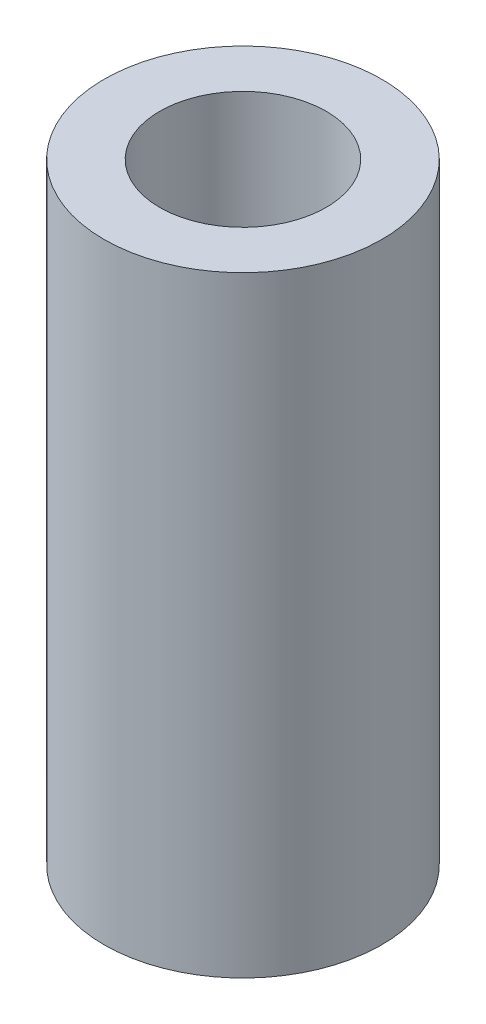
ISO-10303-21;
HEADER;
FILE_DESCRIPTION(('STEP AP214'),'2;1');
FILE_NAME('part.step','',(''),(''),'','','');
FILE_SCHEMA(('AUTOMOTIVE_DESIGN { 1 0 10303 214 1 1 1 1 }'));
ENDSEC;
DATA;
#1=APPLICATION_CONTEXT('core data for automotive mechanical design processes');
#2=APPLICATION_PROTOCOL_DEFINITION('international standard','automotive_design',2000,#1);
#3=PRODUCT_CONTEXT('',#1,'mechanical');
#4=PRODUCT('Part','Part','',(#3));
#5=PRODUCT_RELATED_PRODUCT_CATEGORY('part','',(#4));
#6=PRODUCT_DEFINITION_FORMATION('','',#4);
#7=PRODUCT_DEFINITION_CONTEXT('part definition',#1,'design');
#8=PRODUCT_DEFINITION('design','',#6,#7);
#9=PRODUCT_DEFINITION_SHAPE('','',#8);
#10=(LENGTH_UNIT() NAMED_UNIT(*) SI_UNIT(.MILLI.,.METRE.));
#11=(NAMED_UNIT(*) PLANE_ANGLE_UNIT() SI_UNIT($,.RADIAN.));
#12=(NAMED_UNIT(*) SI_UNIT($,.STERADIAN.) SOLID_ANGLE_UNIT());
#13=UNCERTAINTY_MEASURE_WITH_UNIT(LENGTH_MEASURE(1.E-05),#10,'distance_accuracy_value','');
#14=(GEOMETRIC_REPRESENTATION_CONTEXT(3) GLOBAL_UNCERTAINTY_ASSIGNED_CONTEXT((#13)) GLOBAL_UNIT_ASSIGNED_CONTEXT((#10,
#11,#12)) REPRESENTATION_CONTEXT('',''));
#15=CARTESIAN_POINT('',(0.,0.,0.));
#16=DIRECTION('',(0.,0.,1.));
#17=DIRECTION('',(1.,0.,0.));
#18=AXIS2_PLACEMENT_3D('',#15,#16,#17);
#19=CARTESIAN_POINT('',(0.,11.,0.));
#20=DIRECTION('',(0.,1.,0.));
#21=DIRECTION('',(0.,0.,1.));
#22=AXIS2_PLACEMENT_3D('',#19,#20,#21);
#23=PLANE('',#22);
#24=CARTESIAN_POINT('',(0.,11.,0.));
#25=DIRECTION('',(0.,1.,0.));
#26=DIRECTION('',(0.,0.,1.));
#27=AXIS2_PLACEMENT_3D('',#24,#25,#26);
#28=CIRCLE('',#27,2.5);
#29=CARTESIAN_POINT('',(0.,11.,2.5));
#30=VERTEX_POINT('',#29);
#31=EDGE_CURVE('E10',#30,#30,#28,.T.);
#32=ORIENTED_EDGE('',*,*,#31,.T.);
#33=EDGE_LOOP('',(#32));
#34=FACE_BOUND('',#33,.T.);
#35=CARTESIAN_POINT('',(0.,11.,0.));
#36=DIRECTION('',(0.,1.,0.));
#37=DIRECTION('',(0.,0.,1.));
#38=AXIS2_PLACEMENT_3D('',#35,#36,#37);
#39=CIRCLE('',#38,1.5);
#40=CARTESIAN_POINT('',(0.,11.,1.5));
#41=VERTEX_POINT('',#40);
#42=EDGE_CURVE('E45',#41,#41,#39,.T.);
#43=ORIENTED_EDGE('',*,*,#42,.F.);
#44=EDGE_LOOP('',(#43));
#45=FACE_BOUND('',#44,.T.);
#46=ADVANCED_FACE('F34',(#34,#45),#23,.T.);
#47=CARTESIAN_POINT('',(0.,0.,0.));
#48=DIRECTION('',(0.,1.,0.));
#49=DIRECTION('',(0.,0.,1.));
#50=AXIS2_PLACEMENT_3D('',#47,#48,#49);
#51=PLANE('',#50);
#52=CARTESIAN_POINT('',(0.,0.,0.));
#53=DIRECTION('',(0.,1.,0.));
#54=DIRECTION('',(0.,0.,1.));
#55=AXIS2_PLACEMENT_3D('',#52,#53,#54);
#56=CIRCLE('',#55,2.5);
#57=CARTESIAN_POINT('',(0.,0.,2.5));
#58=VERTEX_POINT('',#57);
#59=EDGE_CURVE('E38',#58,#58,#56,.T.);
#60=ORIENTED_EDGE('',*,*,#59,.F.);
#61=EDGE_LOOP('',(#60));
#62=FACE_BOUND('',#61,.T.);
#63=CARTESIAN_POINT('',(0.,0.,0.));
#64=DIRECTION('',(0.,1.,0.));
#65=DIRECTION('',(0.,0.,1.));
#66=AXIS2_PLACEMENT_3D('',#63,#64,#65);
#67=CIRCLE('',#66,1.5);
#68=CARTESIAN_POINT('',(0.,0.,1.5));
#69=VERTEX_POINT('',#68);
#70=EDGE_CURVE('E47',#69,#69,#67,.T.);
#71=ORIENTED_EDGE('',*,*,#70,.T.);
#72=EDGE_LOOP('',(#71));
#73=FACE_BOUND('',#72,.T.);
#74=ADVANCED_FACE('F57',(#62,#73),#51,.F.);
#75=CARTESIAN_POINT('',(0.,11.,0.));
#76=DIRECTION('',(0.,-1.,0.));
#77=DIRECTION('',(0.,0.,-1.));
#78=AXIS2_PLACEMENT_3D('',#75,#76,#77);
#79=CYLINDRICAL_SURFACE('',#78,2.5);
#80=ORIENTED_EDGE('',*,*,#31,.F.);
#81=EDGE_LOOP('',(#80));
#82=FACE_BOUND('',#81,.T.);
#83=ORIENTED_EDGE('',*,*,#59,.T.);
#84=EDGE_LOOP('',(#83));
#85=FACE_BOUND('',#84,.T.);
#86=ADVANCED_FACE('F36',(#82,#85),#79,.T.);
#87=CARTESIAN_POINT('',(0.,11.,0.));
#88=DIRECTION('',(0.,-1.,0.));
#89=DIRECTION('',(0.,0.,-1.));
#90=AXIS2_PLACEMENT_3D('',#87,#88,#89);
#91=CYLINDRICAL_SURFACE('',#90,1.5);
#92=ORIENTED_EDGE('',*,*,#42,.T.);
#93=EDGE_LOOP('',(#92));
#94=FACE_BOUND('',#93,.T.);
#95=ORIENTED_EDGE('',*,*,#70,.F.);
#96=EDGE_LOOP('',(#95));
#97=FACE_BOUND('',#96,.T.);
#98=ADVANCED_FACE('F53',(#94,#97),#91,.F.);
#99=CLOSED_SHELL('',(#46,#74,#86,#98));
#100=MANIFOLD_SOLID_BREP('B2',#99);
#101=ADVANCED_BREP_SHAPE_REPRESENTATION('',(#18,#100),#14);
#102=SHAPE_DEFINITION_REPRESENTATION(#9,#101);
ENDSEC;
END-ISO-10303-21;
